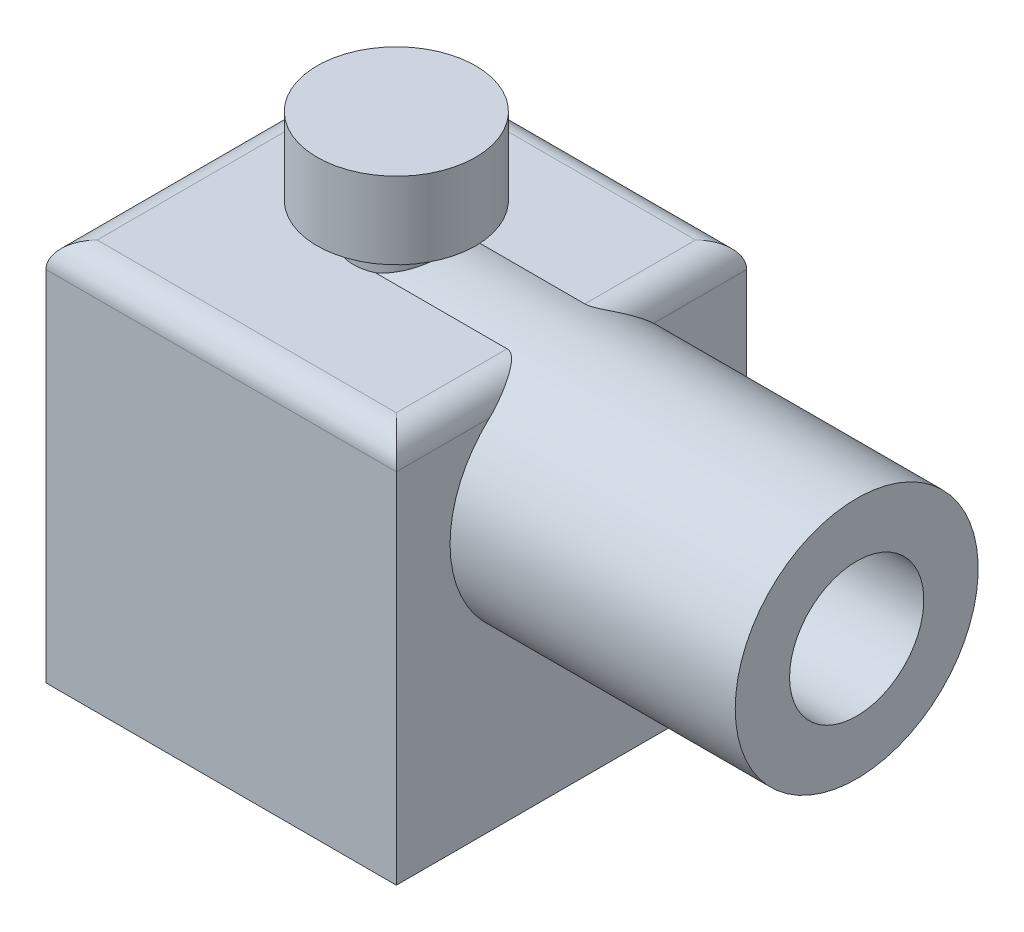
ISO-10303-21;
HEADER;
FILE_DESCRIPTION(('STEP AP214'),'2;1');
FILE_NAME('part.step','',(''),(''),'','','');
FILE_SCHEMA(('AUTOMOTIVE_DESIGN { 1 0 10303 214 1 1 1 1 }'));
ENDSEC;
DATA;
#1=APPLICATION_CONTEXT('core data for automotive mechanical design processes');
#2=APPLICATION_PROTOCOL_DEFINITION('international standard','automotive_design',2000,#1);
#3=PRODUCT_CONTEXT('',#1,'mechanical');
#4=PRODUCT('Part','Part','',(#3));
#5=PRODUCT_RELATED_PRODUCT_CATEGORY('part','',(#4));
#6=PRODUCT_DEFINITION_FORMATION('','',#4);
#7=PRODUCT_DEFINITION_CONTEXT('part definition',#1,'design');
#8=PRODUCT_DEFINITION('design','',#6,#7);
#9=PRODUCT_DEFINITION_SHAPE('','',#8);
#10=(LENGTH_UNIT() NAMED_UNIT(*) SI_UNIT(.MILLI.,.METRE.));
#11=(NAMED_UNIT(*) PLANE_ANGLE_UNIT() SI_UNIT($,.RADIAN.));
#12=(NAMED_UNIT(*) SI_UNIT($,.STERADIAN.) SOLID_ANGLE_UNIT());
#13=UNCERTAINTY_MEASURE_WITH_UNIT(LENGTH_MEASURE(1.E-05),#10,'distance_accuracy_value','');
#14=(GEOMETRIC_REPRESENTATION_CONTEXT(3) GLOBAL_UNCERTAINTY_ASSIGNED_CONTEXT((#13)) GLOBAL_UNIT_ASSIGNED_CONTEXT((#10,
#11,#12)) REPRESENTATION_CONTEXT('',''));
#15=CARTESIAN_POINT('',(0.,0.,0.));
#16=DIRECTION('',(0.,0.,1.));
#17=DIRECTION('',(1.,0.,0.));
#18=AXIS2_PLACEMENT_3D('',#15,#16,#17);
#19=CARTESIAN_POINT('',(0.,38.7,0.));
#20=DIRECTION('',(0.,-1.,0.));
#21=DIRECTION('',(0.,0.,-1.));
#22=AXIS2_PLACEMENT_3D('',#19,#20,#21);
#23=PLANE('',#22);
#24=CARTESIAN_POINT('',(0.,38.7,0.));
#25=DIRECTION('',(0.,-1.,0.));
#26=DIRECTION('',(1.,0.,0.));
#27=AXIS2_PLACEMENT_3D('',#24,#25,#26);
#28=CIRCLE('',#27,6.2);
#29=CARTESIAN_POINT('',(6.2,38.7,0.));
#30=VERTEX_POINT('',#29);
#31=EDGE_CURVE('E11',#30,#30,#28,.T.);
#32=ORIENTED_EDGE('',*,*,#31,.F.);
#33=EDGE_LOOP('',(#32));
#34=FACE_BOUND('',#33,.T.);
#35=ADVANCED_FACE('F17',(#34),#23,.F.);
#36=CARTESIAN_POINT('',(0.,39.135,0.));
#37=DIRECTION('',(0.,-1.,0.));
#38=DIRECTION('',(-1.,0.,0.));
#39=AXIS2_PLACEMENT_3D('',#36,#37,#38);
#40=CYLINDRICAL_SURFACE('',#39,6.2);
#41=CARTESIAN_POINT('',(0.,32.7,0.));
#42=DIRECTION('',(0.,-1.,0.));
#43=DIRECTION('',(1.,0.,0.));
#44=AXIS2_PLACEMENT_3D('',#41,#42,#43);
#45=CIRCLE('',#44,6.2);
#46=CARTESIAN_POINT('',(6.2,32.7,0.));
#47=VERTEX_POINT('',#46);
#48=EDGE_CURVE('E206',#47,#47,#45,.T.);
#49=ORIENTED_EDGE('',*,*,#48,.F.);
#50=DIRECTION('',(0.,1.,0.));
#51=VECTOR('',#50,1.);
#52=CARTESIAN_POINT('',(6.2,39.135,0.));
#53=LINE('',#52,#51);
#54=EDGE_CURVE('E28',#47,#30,#53,.T.);
#55=ORIENTED_EDGE('',*,*,#54,.T.);
#56=ORIENTED_EDGE('',*,*,#31,.T.);
#57=ORIENTED_EDGE('',*,*,#54,.F.);
#58=EDGE_LOOP('',(#49,#55,#56,#57));
#59=FACE_BOUND('',#58,.T.);
#60=ADVANCED_FACE('F313',(#59),#40,.T.);
#61=CARTESIAN_POINT('',(0.,32.7,0.));
#62=DIRECTION('',(0.,-1.,0.));
#63=DIRECTION('',(0.,0.,-1.));
#64=AXIS2_PLACEMENT_3D('',#61,#62,#63);
#65=PLANE('',#64);
#66=CARTESIAN_POINT('',(0.,32.7,0.));
#67=DIRECTION('',(0.,-1.,0.));
#68=DIRECTION('',(1.,0.,0.));
#69=AXIS2_PLACEMENT_3D('',#66,#67,#68);
#70=CIRCLE('',#69,3.35);
#71=CARTESIAN_POINT('',(3.35,32.7,0.));
#72=VERTEX_POINT('',#71);
#73=EDGE_CURVE('E175',#72,#72,#70,.T.);
#74=ORIENTED_EDGE('',*,*,#73,.F.);
#75=EDGE_LOOP('',(#74));
#76=FACE_BOUND('',#75,.T.);
#77=ORIENTED_EDGE('',*,*,#48,.T.);
#78=EDGE_LOOP('',(#77));
#79=FACE_BOUND('',#78,.T.);
#80=ADVANCED_FACE('F316',(#76,#79),#65,.T.);
#81=CARTESIAN_POINT('',(-11.7,28.,49.41864));
#82=DIRECTION('',(0.,0.,-1.));
#83=DIRECTION('',(-1.,0.,0.));
#84=AXIS2_PLACEMENT_3D('',#81,#82,#83);
#85=CYLINDRICAL_SURFACE('',#84,2.);
#86=DIRECTION('',(0.,0.,-1.));
#87=VECTOR('',#86,1.);
#88=CARTESIAN_POINT('',(-13.7,28.,13.7));
#89=LINE('',#88,#87);
#90=CARTESIAN_POINT('',(-13.7,28.,13.7));
#91=VERTEX_POINT('',#90);
#92=CARTESIAN_POINT('',(-13.7,28.,-13.7));
#93=VERTEX_POINT('',#92);
#94=EDGE_CURVE('E126',#91,#93,#89,.T.);
#95=ORIENTED_EDGE('',*,*,#94,.F.);
#96=CARTESIAN_POINT('',(-11.7,28.,11.7));
#97=DIRECTION('',(0.707106781186548,0.,0.707106781186547));
#98=DIRECTION('',(-0.707106781186547,0.,0.707106781186548));
#99=AXIS2_PLACEMENT_3D('',#96,#97,#98);
#100=ELLIPSE('',#99,2.82842712474619,2.);
#101=CARTESIAN_POINT('',(-11.7,30.,11.7));
#102=VERTEX_POINT('',#101);
#103=EDGE_CURVE('E189',#102,#91,#100,.T.);
#104=ORIENTED_EDGE('',*,*,#103,.F.);
#105=DIRECTION('',(0.,0.,-1.));
#106=VECTOR('',#105,1.);
#107=CARTESIAN_POINT('',(-11.7,30.,11.7));
#108=LINE('',#107,#106);
#109=CARTESIAN_POINT('',(-11.7,30.,-11.7));
#110=VERTEX_POINT('',#109);
#111=EDGE_CURVE('E179',#102,#110,#108,.T.);
#112=ORIENTED_EDGE('',*,*,#111,.T.);
#113=CARTESIAN_POINT('',(-11.7,28.,-11.7));
#114=DIRECTION('',(-0.707106781186548,0.,0.707106781186547));
#115=DIRECTION('',(-0.707106781186547,0.,-0.707106781186548));
#116=AXIS2_PLACEMENT_3D('',#113,#114,#115);
#117=ELLIPSE('',#116,2.82842712474619,2.);
#118=EDGE_CURVE('E374',#110,#93,#117,.T.);
#119=ORIENTED_EDGE('',*,*,#118,.T.);
#120=EDGE_LOOP('',(#95,#104,#112,#119));
#121=FACE_BOUND('',#120,.T.);
#122=ADVANCED_FACE('F319',(#121),#85,.T.);
#123=CARTESIAN_POINT('',(-13.7,30.,-13.7));
#124=DIRECTION('',(-1.,0.,0.));
#125=DIRECTION('',(0.,0.,1.));
#126=AXIS2_PLACEMENT_3D('',#123,#124,#125);
#127=PLANE('',#126);
#128=ORIENTED_EDGE('',*,*,#94,.T.);
#129=DIRECTION('',(0.,-1.,0.));
#130=VECTOR('',#129,1.);
#131=CARTESIAN_POINT('',(-13.7,28.,-13.7));
#132=LINE('',#131,#130);
#133=CARTESIAN_POINT('',(-13.7,0.,-13.7));
#134=VERTEX_POINT('',#133);
#135=EDGE_CURVE('E173',#93,#134,#132,.T.);
#136=ORIENTED_EDGE('',*,*,#135,.T.);
#137=DIRECTION('',(0.,0.,1.));
#138=VECTOR('',#137,1.);
#139=CARTESIAN_POINT('',(-13.7,0.,-13.7));
#140=LINE('',#139,#138);
#141=CARTESIAN_POINT('',(-13.7,0.,13.7));
#142=VERTEX_POINT('',#141);
#143=EDGE_CURVE('E203',#134,#142,#140,.T.);
#144=ORIENTED_EDGE('',*,*,#143,.T.);
#145=DIRECTION('',(0.,-1.,0.));
#146=VECTOR('',#145,1.);
#147=CARTESIAN_POINT('',(-13.7,28.,13.7));
#148=LINE('',#147,#146);
#149=EDGE_CURVE('E188',#91,#142,#148,.T.);
#150=ORIENTED_EDGE('',*,*,#149,.F.);
#151=EDGE_LOOP('',(#128,#136,#144,#150));
#152=FACE_BOUND('',#151,.T.);
#153=ADVANCED_FACE('F269',(#152),#127,.T.);
#154=CARTESIAN_POINT('',(-13.7,0.,-13.7));
#155=DIRECTION('',(0.,-1.,0.));
#156=DIRECTION('',(0.,0.,-1.));
#157=AXIS2_PLACEMENT_3D('',#154,#155,#156);
#158=PLANE('',#157);
#159=DIRECTION('',(1.,0.,0.));
#160=VECTOR('',#159,1.);
#161=CARTESIAN_POINT('',(-13.7,0.,-13.7));
#162=LINE('',#161,#160);
#163=CARTESIAN_POINT('',(13.7,0.,-13.7));
#164=VERTEX_POINT('',#163);
#165=EDGE_CURVE('E198',#134,#164,#162,.T.);
#166=ORIENTED_EDGE('',*,*,#165,.T.);
#167=DIRECTION('',(0.,0.,1.));
#168=VECTOR('',#167,1.);
#169=CARTESIAN_POINT('',(13.7,0.,-13.7));
#170=LINE('',#169,#168);
#171=CARTESIAN_POINT('',(13.7,0.,13.7));
#172=VERTEX_POINT('',#171);
#173=EDGE_CURVE('E190',#164,#172,#170,.T.);
#174=ORIENTED_EDGE('',*,*,#173,.T.);
#175=DIRECTION('',(1.,0.,0.));
#176=VECTOR('',#175,1.);
#177=CARTESIAN_POINT('',(-13.7,0.,13.7));
#178=LINE('',#177,#176);
#179=EDGE_CURVE('E377',#142,#172,#178,.T.);
#180=ORIENTED_EDGE('',*,*,#179,.F.);
#181=ORIENTED_EDGE('',*,*,#143,.F.);
#182=EDGE_LOOP('',(#166,#174,#180,#181));
#183=FACE_BOUND('',#182,.T.);
#184=ADVANCED_FACE('F429',(#183),#158,.T.);
#185=CARTESIAN_POINT('',(36.,0.,0.));
#186=DIRECTION('',(1.,0.,0.));
#187=DIRECTION('',(0.,1.,0.));
#188=AXIS2_PLACEMENT_3D('',#185,#186,#187);
#189=PLANE('',#188);
#190=CARTESIAN_POINT('',(36.,21.,0.));
#191=DIRECTION('',(-1.,0.,0.));
#192=DIRECTION('',(0.,0.,-1.));
#193=AXIS2_PLACEMENT_3D('',#190,#191,#192);
#194=CIRCLE('',#193,5.25);
#195=CARTESIAN_POINT('',(36.,21.,5.25));
#196=VERTEX_POINT('',#195);
#197=EDGE_CURVE('E200',#196,#196,#194,.T.);
#198=ORIENTED_EDGE('',*,*,#197,.T.);
#199=EDGE_LOOP('',(#198));
#200=FACE_BOUND('',#199,.T.);
#201=CARTESIAN_POINT('',(36.,21.,0.));
#202=DIRECTION('',(1.,0.,0.));
#203=DIRECTION('',(0.,0.,-1.));
#204=AXIS2_PLACEMENT_3D('',#201,#202,#203);
#205=CIRCLE('',#204,9.5);
#206=CARTESIAN_POINT('',(36.,21.,9.5));
#207=VERTEX_POINT('',#206);
#208=EDGE_CURVE('E162',#207,#207,#205,.T.);
#209=ORIENTED_EDGE('',*,*,#208,.T.);
#210=EDGE_LOOP('',(#209));
#211=FACE_BOUND('',#210,.T.);
#212=ADVANCED_FACE('F267',(#200,#211),#189,.T.);
#213=CARTESIAN_POINT('',(36.,21.,0.));
#214=DIRECTION('',(1.,0.,0.));
#215=DIRECTION('',(0.,0.,-1.));
#216=AXIS2_PLACEMENT_3D('',#213,#214,#215);
#217=CYLINDRICAL_SURFACE('',#216,5.25);
#218=CARTESIAN_POINT('',(13.7,21.,0.));
#219=DIRECTION('',(1.,0.,0.));
#220=DIRECTION('',(0.,0.,1.));
#221=AXIS2_PLACEMENT_3D('',#218,#219,#220);
#222=CIRCLE('',#221,5.25);
#223=CARTESIAN_POINT('',(13.7,21.,5.25));
#224=VERTEX_POINT('',#223);
#225=EDGE_CURVE('E194',#224,#224,#222,.T.);
#226=ORIENTED_EDGE('',*,*,#225,.F.);
#227=DIRECTION('',(1.,0.,0.));
#228=VECTOR('',#227,1.);
#229=CARTESIAN_POINT('',(36.,21.,5.25));
#230=LINE('',#229,#228);
#231=EDGE_CURVE('E193',#224,#196,#230,.T.);
#232=ORIENTED_EDGE('',*,*,#231,.T.);
#233=ORIENTED_EDGE('',*,*,#197,.F.);
#234=ORIENTED_EDGE('',*,*,#231,.F.);
#235=EDGE_LOOP('',(#226,#232,#233,#234));
#236=FACE_BOUND('',#235,.T.);
#237=ADVANCED_FACE('F304',(#236),#217,.F.);
#238=CARTESIAN_POINT('',(13.7,0.,-13.7));
#239=DIRECTION('',(1.,0.,0.));
#240=DIRECTION('',(0.,1.,0.));
#241=AXIS2_PLACEMENT_3D('',#238,#239,#240);
#242=PLANE('',#241);
#243=CARTESIAN_POINT('',(13.7,21.,0.));
#244=DIRECTION('',(1.,0.,0.));
#245=DIRECTION('',(0.,0.,-1.));
#246=AXIS2_PLACEMENT_3D('',#243,#244,#245);
#247=CIRCLE('',#246,9.5);
#248=CARTESIAN_POINT('',(13.7,28.,6.422616289333));
#249=VERTEX_POINT('',#248);
#250=CARTESIAN_POINT('',(13.7,21.,9.5));
#251=VERTEX_POINT('',#250);
#252=EDGE_CURVE('E137',#249,#251,#247,.T.);
#253=ORIENTED_EDGE('',*,*,#252,.F.);
#254=DIRECTION('',(0.,0.,-1.));
#255=VECTOR('',#254,1.);
#256=CARTESIAN_POINT('',(13.7,28.,13.7));
#257=LINE('',#256,#255);
#258=CARTESIAN_POINT('',(13.7,28.,13.7));
#259=VERTEX_POINT('',#258);
#260=EDGE_CURVE('E169',#259,#249,#257,.T.);
#261=ORIENTED_EDGE('',*,*,#260,.F.);
#262=DIRECTION('',(0.,1.,0.));
#263=VECTOR('',#262,1.);
#264=CARTESIAN_POINT('',(13.7,0.,13.7));
#265=LINE('',#264,#263);
#266=EDGE_CURVE('E375',#172,#259,#265,.T.);
#267=ORIENTED_EDGE('',*,*,#266,.F.);
#268=ORIENTED_EDGE('',*,*,#173,.F.);
#269=DIRECTION('',(0.,1.,0.));
#270=VECTOR('',#269,1.);
#271=CARTESIAN_POINT('',(13.7,0.,-13.7));
#272=LINE('',#271,#270);
#273=CARTESIAN_POINT('',(13.7,28.,-13.7));
#274=VERTEX_POINT('',#273);
#275=EDGE_CURVE('E195',#164,#274,#272,.T.);
#276=ORIENTED_EDGE('',*,*,#275,.T.);
#277=DIRECTION('',(0.,0.,-1.));
#278=VECTOR('',#277,1.);
#279=CARTESIAN_POINT('',(13.7,28.,-6.422616289333));
#280=LINE('',#279,#278);
#281=CARTESIAN_POINT('',(13.7,28.,-6.422616289333));
#282=VERTEX_POINT('',#281);
#283=EDGE_CURVE('E114',#282,#274,#280,.T.);
#284=ORIENTED_EDGE('',*,*,#283,.F.);
#285=CARTESIAN_POINT('',(13.7,21.,0.));
#286=DIRECTION('',(1.,0.,0.));
#287=DIRECTION('',(0.,0.,-1.));
#288=AXIS2_PLACEMENT_3D('',#285,#286,#287);
#289=CIRCLE('',#288,9.5);
#290=EDGE_CURVE('E155',#251,#282,#289,.T.);
#291=ORIENTED_EDGE('',*,*,#290,.F.);
#292=EDGE_LOOP('',(#253,#261,#267,#268,#276,#284,#291));
#293=FACE_BOUND('',#292,.T.);
#294=ADVANCED_FACE('F156',(#293),#242,.T.);
#295=CARTESIAN_POINT('',(13.7,0.,-13.7));
#296=DIRECTION('',(1.,0.,0.));
#297=DIRECTION('',(0.,1.,0.));
#298=AXIS2_PLACEMENT_3D('',#295,#296,#297);
#299=PLANE('',#298);
#300=ORIENTED_EDGE('',*,*,#225,.T.);
#301=EDGE_LOOP('',(#300));
#302=FACE_BOUND('',#301,.T.);
#303=ADVANCED_FACE('F234',(#302),#299,.T.);
#304=CARTESIAN_POINT('',(0.,0.,13.7));
#305=DIRECTION('',(0.,0.,1.));
#306=DIRECTION('',(1.,0.,0.));
#307=AXIS2_PLACEMENT_3D('',#304,#305,#306);
#308=PLANE('',#307);
#309=DIRECTION('',(-1.,0.,0.));
#310=VECTOR('',#309,1.);
#311=CARTESIAN_POINT('',(13.7,28.,13.7));
#312=LINE('',#311,#310);
#313=EDGE_CURVE('E184',#259,#91,#312,.T.);
#314=ORIENTED_EDGE('',*,*,#313,.T.);
#315=ORIENTED_EDGE('',*,*,#149,.T.);
#316=ORIENTED_EDGE('',*,*,#179,.T.);
#317=ORIENTED_EDGE('',*,*,#266,.T.);
#318=EDGE_LOOP('',(#314,#315,#316,#317));
#319=FACE_BOUND('',#318,.T.);
#320=ADVANCED_FACE('F431',(#319),#308,.T.);
#321=CARTESIAN_POINT('',(49.41864,28.,11.7));
#322=DIRECTION('',(-1.,0.,0.));
#323=DIRECTION('',(0.,0.,1.));
#324=AXIS2_PLACEMENT_3D('',#321,#322,#323);
#325=CYLINDRICAL_SURFACE('',#324,2.);
#326=DIRECTION('',(-1.,0.,0.));
#327=VECTOR('',#326,1.);
#328=CARTESIAN_POINT('',(11.7,30.,11.7));
#329=LINE('',#328,#327);
#330=CARTESIAN_POINT('',(11.7,30.,11.7));
#331=VERTEX_POINT('',#330);
#332=EDGE_CURVE('E182',#331,#102,#329,.T.);
#333=ORIENTED_EDGE('',*,*,#332,.T.);
#334=ORIENTED_EDGE('',*,*,#103,.T.);
#335=ORIENTED_EDGE('',*,*,#313,.F.);
#336=CARTESIAN_POINT('',(11.7,28.,11.7));
#337=DIRECTION('',(0.707106781186547,0.,-0.707106781186548));
#338=DIRECTION('',(0.707106781186548,0.,0.707106781186547));
#339=AXIS2_PLACEMENT_3D('',#336,#337,#338);
#340=ELLIPSE('',#339,2.82842712474619,2.);
#341=EDGE_CURVE('E354',#331,#259,#340,.T.);
#342=ORIENTED_EDGE('',*,*,#341,.F.);
#343=EDGE_LOOP('',(#333,#334,#335,#342));
#344=FACE_BOUND('',#343,.T.);
#345=ADVANCED_FACE('F19',(#344),#325,.T.);
#346=CARTESIAN_POINT('',(13.7,30.,-13.7));
#347=DIRECTION('',(0.,1.,0.));
#348=DIRECTION('',(1.,0.,0.));
#349=AXIS2_PLACEMENT_3D('',#346,#347,#348);
#350=PLANE('',#349);
#351=CARTESIAN_POINT('',(0.,30.,0.));
#352=DIRECTION('',(0.,-1.,0.));
#353=DIRECTION('',(0.419240952393704,0.,0.907875004522109));
#354=AXIS2_PLACEMENT_3D('',#351,#352,#353);
#355=CIRCLE('',#354,3.35);
#356=CARTESIAN_POINT('',(1.404457190519,30.,3.041381265149));
#357=VERTEX_POINT('',#356);
#358=CARTESIAN_POINT('',(1.404457190519,30.,-3.041381265149));
#359=VERTEX_POINT('',#358);
#360=EDGE_CURVE('E151',#357,#359,#355,.T.);
#361=ORIENTED_EDGE('',*,*,#360,.T.);
#362=DIRECTION('',(1.,0.,0.));
#363=VECTOR('',#362,1.);
#364=CARTESIAN_POINT('',(1.404457190519,30.,-3.041381265149));
#365=LINE('',#364,#363);
#366=CARTESIAN_POINT('',(11.7,30.,-3.041381265149));
#367=VERTEX_POINT('',#366);
#368=EDGE_CURVE('E160',#359,#367,#365,.T.);
#369=ORIENTED_EDGE('',*,*,#368,.T.);
#370=DIRECTION('',(0.,0.,-1.));
#371=VECTOR('',#370,1.);
#372=CARTESIAN_POINT('',(11.7,30.,-3.041381265149));
#373=LINE('',#372,#371);
#374=CARTESIAN_POINT('',(11.7,30.,-11.7));
#375=VERTEX_POINT('',#374);
#376=EDGE_CURVE('E339',#367,#375,#373,.T.);
#377=ORIENTED_EDGE('',*,*,#376,.T.);
#378=DIRECTION('',(1.,0.,0.));
#379=VECTOR('',#378,1.);
#380=CARTESIAN_POINT('',(-11.7,30.,-11.7));
#381=LINE('',#380,#379);
#382=EDGE_CURVE('E369',#110,#375,#381,.T.);
#383=ORIENTED_EDGE('',*,*,#382,.F.);
#384=ORIENTED_EDGE('',*,*,#111,.F.);
#385=ORIENTED_EDGE('',*,*,#332,.F.);
#386=DIRECTION('',(0.,0.,-1.));
#387=VECTOR('',#386,1.);
#388=CARTESIAN_POINT('',(11.7,30.,11.7));
#389=LINE('',#388,#387);
#390=CARTESIAN_POINT('',(11.7,30.,3.041381265149));
#391=VERTEX_POINT('',#390);
#392=EDGE_CURVE('E293',#331,#391,#389,.T.);
#393=ORIENTED_EDGE('',*,*,#392,.T.);
#394=DIRECTION('',(1.,0.,0.));
#395=VECTOR('',#394,1.);
#396=CARTESIAN_POINT('',(1.404457190519,30.,3.041381265149));
#397=LINE('',#396,#395);
#398=EDGE_CURVE('E152',#357,#391,#397,.T.);
#399=ORIENTED_EDGE('',*,*,#398,.F.);
#400=EDGE_LOOP('',(#361,#369,#377,#383,#384,#385,#393,#399));
#401=FACE_BOUND('',#400,.T.);
#402=ADVANCED_FACE('F233',(#401),#350,.T.);
#403=CARTESIAN_POINT('',(0.,39.135,0.));
#404=DIRECTION('',(0.,-1.,0.));
#405=DIRECTION('',(-1.,0.,0.));
#406=AXIS2_PLACEMENT_3D('',#403,#404,#405);
#407=CYLINDRICAL_SURFACE('',#406,3.35);
#408=ORIENTED_EDGE('',*,*,#360,.F.);
#409=CARTESIAN_POINT('',(1.404457190519,30.,3.04138126514902));
#410=CARTESIAN_POINT('',(1.44313302482649,30.0060442643099,3.02352157634422));
#411=CARTESIAN_POINT('',(1.48143933172237,30.0123057875487,3.00493720354744));
#412=CARTESIAN_POINT('',(1.56107049923112,30.0258254467507,2.96441385547286));
#413=CARTESIAN_POINT('',(1.60231306468751,30.0331205686363,2.94232534938207));
#414=CARTESIAN_POINT('',(1.68750871775984,30.0487048198177,2.89437669822332));
#415=CARTESIAN_POINT('',(1.73136616254205,30.0570239391425,2.86835628937065));
#416=CARTESIAN_POINT('',(1.82142016963686,30.0746637317243,2.81211265567683));
#417=CARTESIAN_POINT('',(1.86750584148753,30.0840099989195,2.78171992873564));
#418=CARTESIAN_POINT('',(1.96157966711492,30.1037098970144,2.71629082189942));
#419=CARTESIAN_POINT('',(2.00944021105804,30.1140856093221,2.68107708611437));
#420=CARTESIAN_POINT('',(2.08100621352498,30.130117412407,2.62543178709402));
#421=CARTESIAN_POINT('',(2.10542756104993,30.1356841323705,2.60588805941187));
#422=CARTESIAN_POINT('',(2.15452492508274,30.1470828231767,2.56545663473709));
#423=CARTESIAN_POINT('',(2.17918135254791,30.1529173760742,2.54454583516168));
#424=CARTESIAN_POINT('',(2.23213182429606,30.1656305271502,2.49830534019359));
#425=CARTESIAN_POINT('',(2.26030837992368,30.1725133562521,2.47284213236715));
#426=CARTESIAN_POINT('',(2.31418189026497,30.1858492894502,2.42246619162599));
#427=CARTESIAN_POINT('',(2.33992808016231,30.1923042596518,2.39760656300007));
#428=CARTESIAN_POINT('',(2.38906012782484,30.2048011070776,2.34862092167487));
#429=CARTESIAN_POINT('',(2.41249394581646,30.2108440597117,2.32454330055582));
#430=CARTESIAN_POINT('',(2.45712307855881,30.2225121693487,2.27728620828581));
#431=CARTESIAN_POINT('',(2.4783646618579,30.2281388489367,2.25415070733718));
#432=CARTESIAN_POINT('',(2.53672327388903,30.2438067620403,2.18876598271184));
#433=CARTESIAN_POINT('',(2.57311882105254,30.2538223105889,2.14586190946099));
#434=CARTESIAN_POINT('',(2.63820734800497,30.2721735457055,2.06509479859978));
#435=CARTESIAN_POINT('',(2.66721620729274,30.280527552758,2.02748947061637));
#436=CARTESIAN_POINT('',(2.71840996960852,30.29556340322,1.95812312539101));
#437=CARTESIAN_POINT('',(2.74086509253115,30.3022689047034,1.92656668050016));
#438=CARTESIAN_POINT('',(2.77971848530504,30.3139645179401,1.86990984261963));
#439=CARTESIAN_POINT('',(2.79633557737002,30.3189988186896,1.84496808256135));
#440=CARTESIAN_POINT('',(2.84473887261309,30.3336658255465,1.77015658321491));
#441=CARTESIAN_POINT('',(2.87557684713759,30.3430139617381,1.71961185744142));
#442=CARTESIAN_POINT('',(2.93400312082362,30.3609240037754,1.61786950487481));
#443=CARTESIAN_POINT('',(2.96164259746589,30.3694975905367,1.56670323773141));
#444=CARTESIAN_POINT('',(3.01374731987846,30.3858062589579,1.46392650730169));
#445=CARTESIAN_POINT('',(3.03826401291403,30.3935544457105,1.41234423133019));
#446=CARTESIAN_POINT('',(3.08420160715816,30.4082253601698,1.30894516884524));
#447=CARTESIAN_POINT('',(3.1056741581737,30.4151613857389,1.25715321009829));
#448=CARTESIAN_POINT('',(3.14561512208117,30.42820400502,1.15352793862636));
#449=CARTESIAN_POINT('',(3.16413510894083,30.4343244335999,1.10171624888785));
#450=CARTESIAN_POINT('',(3.19827140729771,30.4457362928804,0.998232457238896));
#451=CARTESIAN_POINT('',(3.21393900915263,30.4510420240408,0.946578852382088));
#452=CARTESIAN_POINT('',(3.24247927397372,30.4608237591032,0.843578733895279));
#453=CARTESIAN_POINT('',(3.25540273242948,30.4653145664416,0.792247702703012));
#454=CARTESIAN_POINT('',(3.27857026877931,30.473466000846,0.690047149870981));
#455=CARTESIAN_POINT('',(3.28886445170324,30.4771419422808,0.639190209445663));
#456=CARTESIAN_POINT('',(3.30689463394972,30.4836631287576,0.538079205964679));
#457=CARTESIAN_POINT('',(3.3146798637381,30.4865242127137,0.487834945290695));
#458=CARTESIAN_POINT('',(3.32781799417243,30.4914150730173,0.388077932425546));
#459=CARTESIAN_POINT('',(3.33321907499692,30.4934612256322,0.33857232991744));
#460=CARTESIAN_POINT('',(3.3417178036732,30.4967219671331,0.240408527805103));
#461=CARTESIAN_POINT('',(3.34486242871161,30.4979534708646,0.191754962118386));
#462=CARTESIAN_POINT('',(3.34898125037852,30.499583310001,0.0953997575580311));
#463=CARTESIAN_POINT('',(3.35000103527652,30.499999134041,0.0477003556813545));
#464=CARTESIAN_POINT('',(3.35,30.5,0.));
#465=B_SPLINE_CURVE_WITH_KNOTS('',3,(#409,#410,#411,#412,#413,#414,#415,#416,#417,#418,#419,
#420,#421,#422,#423,#424,#425,#426,#427,#428,#429,#430,#431,#432,#433,#434,#435,#436,#437,#438,
#439,#440,#441,#442,#443,#444,#445,#446,#447,#448,#449,#450,#451,#452,#453,#454,#455,#456,#457,
#458,#459,#460,#461,#462,#463,#464),.UNSPECIFIED.,.F.,.F.,(4,2,2,2,2,2,2,2,2,2,2,2,2,2,2,2,2,2,
2,2,2,2,2,2,2,2,2,4),(0.,0.129071875369828,0.271081112518538,0.42603597993999,0.593942677266448,
0.774805914596905,0.870106501888238,0.968648441578384,1.08441483879826,1.19349704272756,
1.29589498477846,1.39160860944263,1.5629695975656,1.70759831958757,1.82549355145165,
1.91665528400892,2.09638918669355,2.27265897254724,2.44548647789371,2.6148948729573,
2.7809087623601,2.9435542940711,3.1028592774992,3.25885331145639,3.4115679227456,
3.56103671614702,3.70729553658195,3.85038264422029),.UNSPECIFIED.);
#466=CARTESIAN_POINT('',(3.35,30.5,0.));
#467=VERTEX_POINT('',#466);
#468=EDGE_CURVE('E217',#357,#467,#465,.T.);
#469=ORIENTED_EDGE('',*,*,#468,.T.);
#470=DIRECTION('',(0.,1.,0.));
#471=VECTOR('',#470,1.);
#472=CARTESIAN_POINT('',(3.35,39.135,0.));
#473=LINE('',#472,#471);
#474=EDGE_CURVE('E180',#467,#72,#473,.T.);
#475=ORIENTED_EDGE('',*,*,#474,.T.);
#476=ORIENTED_EDGE('',*,*,#73,.T.);
#477=ORIENTED_EDGE('',*,*,#474,.F.);
#478=CARTESIAN_POINT('',(3.35,30.5,0.));
#479=CARTESIAN_POINT('',(3.35000103501008,30.4999991325421,-0.0476963839830357));
#480=CARTESIAN_POINT('',(3.34898142002569,30.4995833028249,-0.0953918135329404));
#481=CARTESIAN_POINT('',(3.34486324961289,30.4979534644943,-0.191739817192207));
#482=CARTESIAN_POINT('',(3.34171907815181,30.4967219542589,-0.240390153048963));
#483=CARTESIAN_POINT('',(3.33322148265371,30.4934612125082,-0.338548253962389));
#484=CARTESIAN_POINT('',(3.32782105241903,30.4914150543119,-0.388051382462744));
#485=CARTESIAN_POINT('',(3.31468435879904,30.4865241940668,-0.487804213621036));
#486=CARTESIAN_POINT('',(3.30689988507775,30.4836631049208,-0.538046762486616));
#487=CARTESIAN_POINT('',(3.28887125631897,30.4771419184271,-0.639155108190687));
#488=CARTESIAN_POINT('',(3.27857783959945,30.473465972288,-0.690011096941407));
#489=CARTESIAN_POINT('',(3.25541177940587,30.4653145379364,-0.792210502821788));
#490=CARTESIAN_POINT('',(3.2424889987309,30.4608237263569,-0.843541331309217));
#491=CARTESIAN_POINT('',(3.21394993316732,30.4510419912515,-0.946541781468841));
#492=CARTESIAN_POINT('',(3.1982828197785,30.4457362560988,-0.998195911420266));
#493=CARTESIAN_POINT('',(3.1641472403824,30.4343243972219,-1.10168146056839));
#494=CARTESIAN_POINT('',(3.14562745029404,30.4282039656144,-1.15349437144151));
#495=CARTESIAN_POINT('',(3.10568652016104,30.4151613451171,-1.25712275092461));
#496=CARTESIAN_POINT('',(3.08421377186588,30.4082253145552,-1.30891658314167));
#497=CARTESIAN_POINT('',(3.03827532095394,30.3935544052476,-1.41232000678408));
#498=CARTESIAN_POINT('',(3.01375793381579,30.3858062227321,-1.46390475481608));
#499=CARTESIAN_POINT('',(2.96165126577489,30.3694975349408,-1.5666869720405));
#500=CARTESIAN_POINT('',(2.93401050276725,30.3609239182441,-1.6178562357473));
#501=CARTESIAN_POINT('',(2.87558098786915,30.3430139516844,-1.71960506909789));
#502=CARTESIAN_POINT('',(2.8447410232486,30.3336659189086,-1.77015325898445));
#503=CARTESIAN_POINT('',(2.79633750608847,30.3189996862512,-1.84496510167925));
#504=CARTESIAN_POINT('',(2.77972242320316,30.3139662389966,-1.86990393154645));
#505=CARTESIAN_POINT('',(2.74087242340204,30.3022720062828,-1.92655620859352));
#506=CARTESIAN_POINT('',(2.71841867109188,30.2955669728491,-1.95811100305702));
#507=CARTESIAN_POINT('',(2.66722695236922,30.2805317731069,-2.02747531846652));
#508=CARTESIAN_POINT('',(2.6382187312914,30.272177930347,-2.06508023954895));
#509=CARTESIAN_POINT('',(2.57313066660379,30.2538267007483,-2.14584772418804));
#510=CARTESIAN_POINT('',(2.5367348918955,30.2438109758371,-2.18875253580568));
#511=CARTESIAN_POINT('',(2.47837555075501,30.228142660408,-2.25413874768518));
#512=CARTESIAN_POINT('',(2.45713347490638,30.222515771569,-2.27727500312162));
#513=CARTESIAN_POINT('',(2.41250308080777,30.2108471604606,-2.32453383790549));
#514=CARTESIAN_POINT('',(2.38906848486318,30.2048039143337,-2.34861243849735));
#515=CARTESIAN_POINT('',(2.33993457912262,30.1923063987365,-2.39760024425775));
#516=CARTESIAN_POINT('',(2.31418729924285,30.1858510529229,-2.42246104801968));
#517=CARTESIAN_POINT('',(2.26031128085309,30.1725142809139,-2.47283951081045));
#518=CARTESIAN_POINT('',(2.23213329677114,30.1656309873083,-2.4983040543037));
#519=CARTESIAN_POINT('',(2.17918304215149,30.152917690991,-2.54454435967565));
#520=CARTESIAN_POINT('',(2.15452834711065,30.1470834534679,-2.56545373260531));
#521=CARTESIAN_POINT('',(2.10543421224009,30.135685338439,-2.60588266351938));
#522=CARTESIAN_POINT('',(2.08101435290472,30.1301188791824,-2.62542531365552));
#523=CARTESIAN_POINT('',(2.00945193596211,30.1140876657551,-2.68106824414561));
#524=CARTESIAN_POINT('',(1.96159353218031,30.1037123013225,-2.71628075573796));
#525=CARTESIAN_POINT('',(1.86752276691532,30.0840128652292,-2.78170854950143));
#526=CARTESIAN_POINT('',(1.8214379647382,30.0746667165218,-2.81210111365872));
#527=CARTESIAN_POINT('',(1.73138432715789,30.0570269236743,-2.86834533940474));
#528=CARTESIAN_POINT('',(1.68752634150741,30.0487076921863,-2.89436643743781));
#529=CARTESIAN_POINT('',(1.6023281254317,30.0331229803889,-2.94231718644768));
#530=CARTESIAN_POINT('',(1.56108350562488,30.0258275194122,-2.96440704477747));
#531=CARTESIAN_POINT('',(1.48144667192356,30.0123069318905,-3.00493364260277));
#532=CARTESIAN_POINT('',(1.44313672777537,30.0060448347954,-3.02351986668187));
#533=CARTESIAN_POINT('',(1.404457190519,30.,-3.04138126514902));
#534=B_SPLINE_CURVE_WITH_KNOTS('',3,(#478,#479,#480,#481,#482,#483,#484,#485,#486,#487,#488,
#489,#490,#491,#492,#493,#494,#495,#496,#497,#498,#499,#500,#501,#502,#503,#504,#505,#506,#507,
#508,#509,#510,#511,#512,#513,#514,#515,#516,#517,#518,#519,#520,#521,#522,#523,#524,#525,#526,
#527,#528,#529,#530,#531,#532,#533),.UNSPECIFIED.,.F.,.F.,(4,2,2,2,2,2,2,2,2,2,2,2,2,2,2,2,2,2,
2,2,2,2,2,2,2,2,2,4),(0.,0.143075194254705,0.28932427018435,0.438785488563866,0.591494693159923,
0.747485486123539,0.906789390400916,1.06943599993319,1.23545311842828,1.40486688748227,
1.5777019048081,1.75398133330088,1.93372700163424,2.02487780259341,2.14276647388611,
2.28739300881744,2.45875618409829,2.5544725434579,2.65687431416622,2.76596144073504,
2.88173385458342,2.98026900441707,3.07556403590924,3.25641986650167,3.42432409442193,
3.57928143171343,3.72129807968204,3.85038230785889),.UNSPECIFIED.);
#535=EDGE_CURVE('E251',#467,#359,#534,.T.);
#536=ORIENTED_EDGE('',*,*,#535,.T.);
#537=EDGE_LOOP('',(#408,#469,#475,#476,#477,#536));
#538=FACE_BOUND('',#537,.T.);
#539=ADVANCED_FACE('F224',(#538),#407,.T.);
#540=CARTESIAN_POINT('',(36.,21.,0.));
#541=DIRECTION('',(1.,0.,0.));
#542=DIRECTION('',(0.,0.,-1.));
#543=AXIS2_PLACEMENT_3D('',#540,#541,#542);
#544=CYLINDRICAL_SURFACE('',#543,9.5);
#545=ORIENTED_EDGE('',*,*,#208,.F.);
#546=DIRECTION('',(-1.,0.,0.));
#547=VECTOR('',#546,1.);
#548=CARTESIAN_POINT('',(36.,21.,9.5));
#549=LINE('',#548,#547);
#550=EDGE_CURVE('E142',#207,#251,#549,.T.);
#551=ORIENTED_EDGE('',*,*,#550,.T.);
#552=ORIENTED_EDGE('',*,*,#290,.T.);
#553=CARTESIAN_POINT('',(13.7,28.,-6.42261628933256));
#554=CARTESIAN_POINT('',(13.7000002141254,28.0311544314174,-6.38866176934703));
#555=CARTESIAN_POINT('',(13.6992771860406,28.0620598955814,-6.35448138634665));
#556=CARTESIAN_POINT('',(13.6964228362274,28.1237590431218,-6.28523939254143));
#557=CARTESIAN_POINT('',(13.6942725082844,28.1545454988138,-6.25017211859649));
#558=CARTESIAN_POINT('',(13.6885641022124,28.2159805022175,-6.1791473687295));
#559=CARTESIAN_POINT('',(13.6849863257697,28.2466207768704,-6.14318433443044));
#560=CARTESIAN_POINT('',(13.676423729351,28.3077380845068,-6.07035891180273));
#561=CARTESIAN_POINT('',(13.6714186725136,28.3382058278512,-6.03349111612216));
#562=CARTESIAN_POINT('',(13.6600019679366,28.3989517266487,-5.95884759514462));
#563=CARTESIAN_POINT('',(13.6535696839586,28.4292195904669,-5.92106666132039));
#564=CARTESIAN_POINT('',(13.6392989506737,28.4895387630269,-5.8445888577556));
#565=CARTESIAN_POINT('',(13.6314395983338,28.5195788078425,-5.80588701749481));
#566=CARTESIAN_POINT('',(13.6143146879152,28.5794149820574,-5.72755943950508));
#567=CARTESIAN_POINT('',(13.6050280743093,28.6091989161594,-5.6879289918404));
#568=CARTESIAN_POINT('',(13.5850497592537,28.6684937341537,-5.60773867349203));
#569=CARTESIAN_POINT('',(13.5743369794098,28.6979915147741,-5.5671744086923));
#570=CARTESIAN_POINT('',(13.5412040910999,28.783160936058,-5.44809065534093));
#571=CARTESIAN_POINT('',(13.5171370303085,28.8377476602672,-5.36924444442708));
#572=CARTESIAN_POINT('',(13.4644687107768,28.9441177597689,-5.21058183552658));
#573=CARTESIAN_POINT('',(13.4358457940534,28.995886073839,-5.13076257588309));
#574=CARTESIAN_POINT('',(13.3740813379499,29.0966425404801,-4.97025337300143));
#575=CARTESIAN_POINT('',(13.3409095732216,29.1456086973906,-4.88956124597278));
#576=CARTESIAN_POINT('',(13.2700307898162,29.2407736121963,-4.72742766085546));
#577=CARTESIAN_POINT('',(13.2322855950501,29.286943454874,-4.64598600302349));
#578=CARTESIAN_POINT('',(13.1510965943811,29.377985933123,-4.47980947177022));
#579=CARTESIAN_POINT('',(13.1074781182096,29.4227186576595,-4.39508270710491));
#580=CARTESIAN_POINT('',(13.0393215543965,29.4862554413259,-4.27030855636798));
#581=CARTESIAN_POINT('',(13.0166556578531,29.5064470247145,-4.22993727876282));
#582=CARTESIAN_POINT('',(12.9707359503727,29.5454509542339,-4.1505625176565));
#583=CARTESIAN_POINT('',(12.9475144240298,29.5642858020718,-4.1115514840446));
#584=CARTESIAN_POINT('',(12.9004862625274,29.6006404284688,-4.03493909929606));
#585=CARTESIAN_POINT('',(12.8767122274703,29.6181819627185,-3.99732807804695));
#586=CARTESIAN_POINT('',(12.8285785831805,29.6520128630973,-3.92355393777409));
#587=CARTESIAN_POINT('',(12.8042518125472,29.6683231999686,-3.8873790500562));
#588=CARTESIAN_POINT('',(12.7550097330997,29.6997513623074,-3.8165152303152));
#589=CARTESIAN_POINT('',(12.7301273712066,29.7148893816557,-3.78181238626601));
#590=CARTESIAN_POINT('',(12.6797847917271,29.7440346351576,-3.7139179430088));
#591=CARTESIAN_POINT('',(12.6543570373324,29.7580611478287,-3.68071061080573));
#592=CARTESIAN_POINT('',(12.6089146858606,29.7818691406107,-3.62346143003956));
#593=CARTESIAN_POINT('',(12.589189332208,29.7918147901814,-3.59925834095292));
#594=CARTESIAN_POINT('',(12.5497527899906,29.8108651283863,-3.5523611139218));
#595=CARTESIAN_POINT('',(12.5300751394827,29.8199875893807,-3.52964608584529));
#596=CARTESIAN_POINT('',(12.4907409049273,29.8374295068982,-3.4857386181222));
#597=CARTESIAN_POINT('',(12.4711187265456,29.8457666094233,-3.46452243811645));
#598=CARTESIAN_POINT('',(12.4318920846889,29.8616707071158,-3.42363149527878));
#599=CARTESIAN_POINT('',(12.4123231109877,29.8692554006432,-3.40392967516152));
#600=CARTESIAN_POINT('',(12.3732024166967,29.8836858454086,-3.36608346560878));
#601=CARTESIAN_POINT('',(12.3536868555254,29.8905493828518,-3.34790859769496));
#602=CARTESIAN_POINT('',(12.3146720009002,29.9035661327391,-3.31313138919232));
#603=CARTESIAN_POINT('',(12.2952091454416,29.9097372712848,-3.29649503648221));
#604=CARTESIAN_POINT('',(12.2563000556232,29.9213952680769,-3.26480917270423));
#605=CARTESIAN_POINT('',(12.2368899296906,29.9269002154305,-3.24972211392575));
#606=CARTESIAN_POINT('',(12.1980847709103,29.9372500361109,-3.22114616196353));
#607=CARTESIAN_POINT('',(12.178724896533,29.9421131047189,-3.20761645855429));
#608=CARTESIAN_POINT('',(12.1493950992301,29.9489995448457,-3.1883305822964));
#609=CARTESIAN_POINT('',(12.139733065724,29.9511937036236,-3.18216470995698));
#610=CARTESIAN_POINT('',(12.1204180530548,29.9554269682382,-3.17023138389082));
#611=CARTESIAN_POINT('',(12.1107690528203,29.9574683477933,-3.16445831533854));
#612=CARTESIAN_POINT('',(12.0914805958697,29.9613983019955,-3.153311702738));
#613=CARTESIAN_POINT('',(12.0818449124909,29.9632891356673,-3.14793243134071));
#614=CARTESIAN_POINT('',(12.0625832172123,29.9669201712538,-3.13757424846977));
#615=CARTESIAN_POINT('',(12.0529607485748,29.9686626056222,-3.13258954046349));
#616=CARTESIAN_POINT('',(12.0337257464384,29.971998851919,-3.12302125906944));
#617=CARTESIAN_POINT('',(12.0241164925881,29.9735948574274,-3.11843186675726));
#618=CARTESIAN_POINT('',(12.0049081891766,29.9766401168398,-3.10965486800984));
#619=CARTESIAN_POINT('',(11.9953121269145,29.9780915103602,-3.10546147615112));
#620=CARTESIAN_POINT('',(11.9761305122394,29.9808492739647,-3.09747701382449));
#621=CARTESIAN_POINT('',(11.9665476292247,29.9821577124192,-3.09368025491734));
#622=CARTESIAN_POINT('',(11.9473927020669,29.984631154913,-3.08648946770918));
#623=CARTESIAN_POINT('',(11.9378229895554,29.9857981366001,-3.08308991879985));
#624=CARTESIAN_POINT('',(11.9186947521102,29.9879901167641,-3.07669382949415));
#625=CARTESIAN_POINT('',(11.9091382084451,29.9890169808264,-3.07369201334804));
#626=CARTESIAN_POINT('',(11.8900366687303,29.9909300408314,-3.06809153053912));
#627=CARTESIAN_POINT('',(11.8804933000386,29.9918179675448,-3.06548791454911));
#628=CARTESIAN_POINT('',(11.8614184718107,29.9934543323498,-3.060683834557));
#629=CARTESIAN_POINT('',(11.8518882927429,29.9942043428797,-3.05847883144757));
#630=CARTESIAN_POINT('',(11.8328401969916,29.9955659211782,-3.05447183471157));
#631=CARTESIAN_POINT('',(11.8233232326014,29.9961788795463,-3.0526657954909));
#632=CARTESIAN_POINT('',(11.8043018940193,29.99726725931,-3.04945646223364));
#633=CARTESIAN_POINT('',(11.794798175,29.9977438669822,-3.04804969535933));
#634=CARTESIAN_POINT('',(11.775803635084,29.9985603314789,-3.0456384486689));
#635=CARTESIAN_POINT('',(11.7663132152976,29.9989011495672,-3.0446311412972));
#636=CARTESIAN_POINT('',(11.7473454826805,29.9994466183464,-3.04301845643824));
#637=CARTESIAN_POINT('',(11.7378683715946,29.9996519881183,-3.04241095645213));
#638=CARTESIAN_POINT('',(11.7189276024918,29.9999272355146,-3.04159658571886));
#639=CARTESIAN_POINT('',(11.7094640098112,29.9999975754169,-3.04138834809068));
#640=CARTESIAN_POINT('',(11.7,30.,-3.04138126514909));
#641=B_SPLINE_CURVE_WITH_KNOTS('',3,(#553,#554,#555,#556,#557,#558,#559,#560,#561,#562,#563,
#564,#565,#566,#567,#568,#569,#570,#571,#572,#573,#574,#575,#576,#577,#578,#579,#580,#581,#582,
#583,#584,#585,#586,#587,#588,#589,#590,#591,#592,#593,#594,#595,#596,#597,#598,#599,#600,#601,
#602,#603,#604,#605,#606,#607,#608,#609,#610,#611,#612,#613,#614,#615,#616,#617,#618,#619,#620,
#621,#622,#623,#624,#625,#626,#627,#628,#629,#630,#631,#632,#633,#634,#635,#636,#637,#638,#639,
#640),.UNSPECIFIED.,.F.,.F.,(4,2,2,2,2,2,2,2,2,2,2,2,2,2,2,2,2,2,2,2,2,2,2,2,2,2,2,2,2,2,2,2,2,
2,2,2,2,2,2,2,2,2,2,4),(0.,0.138234979326607,0.278348675432755,0.420466747426666,
0.564709616037122,0.711192461765789,0.860025264647288,1.01131287977181,1.1651551428362,
1.46160803130461,1.75951479855352,2.0595067332072,2.36220207807901,2.67784210148126,
2.82935463088595,2.97678573955455,3.12024634433525,3.25985682742251,3.39574780517255,
3.52806091140743,3.62635318944218,3.72055702730166,3.81077101656698,3.89710741966273,
3.97969431436848,4.05867802196809,4.13422580371099,4.20652877116427,4.24153418702326,
4.27581264260187,4.30939606986276,4.34231842320291,4.37461574207288,4.4063261970913,
4.43749011539335,4.46814998079001,4.4983504043731,4.52813806154455,4.55756159212867,
4.58667146127559,4.61551978027683,4.64416008814184,4.67264709672708,4.70103640421975),.UNSPECIFIED.);
#642=EDGE_CURVE('E340',#282,#367,#641,.T.);
#643=ORIENTED_EDGE('',*,*,#642,.T.);
#644=ORIENTED_EDGE('',*,*,#368,.F.);
#645=ORIENTED_EDGE('',*,*,#535,.F.);
#646=ORIENTED_EDGE('',*,*,#468,.F.);
#647=ORIENTED_EDGE('',*,*,#398,.T.);
#648=CARTESIAN_POINT('',(11.7,30.,3.04138126514911));
#649=CARTESIAN_POINT('',(11.709462396178,29.999997575879,3.04138834673071));
#650=CARTESIAN_POINT('',(11.7189243744687,29.9999272356121,3.04159658543205));
#651=CARTESIAN_POINT('',(11.7378620193017,29.9996519890312,3.04241095374997));
#652=CARTESIAN_POINT('',(11.7473376202728,29.9994466188479,3.04301845495302));
#653=CARTESIAN_POINT('',(11.7663024369693,29.9989011508271,3.04463113757465));
#654=CARTESIAN_POINT('',(11.7757914504598,29.9985603322767,3.04563844630823));
#655=CARTESIAN_POINT('',(11.7947832824696,29.9977438684708,3.04804969096783));
#656=CARTESIAN_POINT('',(11.8042856991376,29.9972672603149,3.04945645926243));
#657=CARTESIAN_POINT('',(11.8233045379227,29.9961788811905,3.05266579065075));
#658=CARTESIAN_POINT('',(11.8328203038899,29.9955659223346,3.05447183129633));
#659=CARTESIAN_POINT('',(11.8518661079419,29.9942043446309,3.05847882630633));
#660=CARTESIAN_POINT('',(11.8613951925514,29.9934543336268,3.06068383079081));
#661=CARTESIAN_POINT('',(11.8804679372042,29.9918179693803,3.06548790917763));
#662=CARTESIAN_POINT('',(11.8900103154344,29.9909300422202,3.06809152645112));
#663=CARTESIAN_POINT('',(11.9091099797217,29.9890169827429,3.07369200776005));
#664=CARTESIAN_POINT('',(11.9186656369617,29.9879901182719,3.07669382506679));
#665=CARTESIAN_POINT('',(11.9377922071555,29.9857981386089,3.08308991296669));
#666=CARTESIAN_POINT('',(11.9473611373189,29.9846311565576,3.08648946289403));
#667=CARTESIAN_POINT('',(11.9665146054304,29.9821577145405,3.09368024878454));
#668=CARTESIAN_POINT('',(11.9760968102137,29.98084927577,3.09747700855791));
#669=CARTESIAN_POINT('',(11.9952771740765,29.9780915126185,3.10546146965319));
#670=CARTESIAN_POINT('',(12.0048726622603,29.9766401188306,3.10965486222622));
#671=CARTESIAN_POINT('',(12.0240799231212,29.9735948598466,3.11843185983117));
#672=CARTESIAN_POINT('',(12.033688707079,29.971998854117,3.12302125271415));
#673=CARTESIAN_POINT('',(12.0529228749504,29.9686626082228,3.13258953305754));
#674=CARTESIAN_POINT('',(12.0625449779065,29.9669201736765,3.13757424150173));
#675=CARTESIAN_POINT('',(12.0818060472316,29.9632891384612,3.14793242342889));
#676=CARTESIAN_POINT('',(12.0914414691674,29.9613983046454,3.15331169515972));
#677=CARTESIAN_POINT('',(12.1107295084793,29.9574683507903,3.16445830690173));
#678=CARTESIAN_POINT('',(12.1203783515045,29.9554269711335,3.1702313756615));
#679=CARTESIAN_POINT('',(12.1396931549217,29.9511937067977,3.1821647010783));
#680=CARTESIAN_POINT('',(12.1493551355395,29.948999547898,3.18833057367965));
#681=CARTESIAN_POINT('',(12.1786850342585,29.9421130841264,3.20761651636585));
#682=CARTESIAN_POINT('',(12.1980451109577,29.9372500150953,3.22114621982292));
#683=CARTESIAN_POINT('',(12.2368510958887,29.9269001962122,3.24972216716012));
#684=CARTESIAN_POINT('',(12.2562618430946,29.9213952488127,3.26480922490425));
#685=CARTESIAN_POINT('',(12.2951725933645,29.9097372535958,3.29649508472618));
#686=CARTESIAN_POINT('',(12.3146364879581,29.9035661151862,3.31313143590648));
#687=CARTESIAN_POINT('',(12.3536538376579,29.8905493668312,3.3479086406881));
#688=CARTESIAN_POINT('',(12.3731708569456,29.8836858298723,3.36608350626607));
#689=CARTESIAN_POINT('',(12.4122948779144,29.8692553856317,3.40392971462464));
#690=CARTESIAN_POINT('',(12.431865723913,29.8616706915574,3.42363153495791));
#691=CARTESIAN_POINT('',(12.4710965364696,29.8457665968682,3.46452247073449));
#692=CARTESIAN_POINT('',(12.490721019129,29.8374294977751,3.4857386415204));
#693=CARTESIAN_POINT('',(12.5300602184358,29.819987571595,3.52964613016701));
#694=CARTESIAN_POINT('',(12.5497405332257,29.8108650976758,3.55236118833084));
#695=CARTESIAN_POINT('',(12.5891830329161,29.7918147952721,3.59925832966519));
#696=CARTESIAN_POINT('',(12.6089116962624,29.7818691970794,3.62346129478864));
#697=CARTESIAN_POINT('',(12.6543466663684,29.7580686126367,3.68069266005782));
#698=CARTESIAN_POINT('',(12.6797641828165,29.744049773914,3.71388211356712));
#699=CARTESIAN_POINT('',(12.7300891456599,29.7149180721092,3.78174612928725));
#700=CARTESIAN_POINT('',(12.7549639237808,29.6997858251059,3.81643653335045));
#701=CARTESIAN_POINT('',(12.8041940825646,29.6683673574513,3.88728049952268));
#702=CARTESIAN_POINT('',(12.8285163336602,29.6520608403982,3.92344805569955));
#703=CARTESIAN_POINT('',(12.8766440522695,29.6182355184776,3.9972125807961));
#704=CARTESIAN_POINT('',(12.9004165094674,29.6006956395717,4.03482138321125));
#705=CARTESIAN_POINT('',(12.9474446867892,29.5643420862342,4.11143427255018));
#706=CARTESIAN_POINT('',(12.9706676514697,29.5455065529105,4.15044807603965));
#707=CARTESIAN_POINT('',(13.0165932229293,29.5064987694268,4.22983330481541));
#708=CARTESIAN_POINT('',(13.0392633989304,29.4863039126472,4.27021231285529));
#709=CARTESIAN_POINT('',(13.1074423379565,29.4227496553715,4.39502402496178));
#710=CARTESIAN_POINT('',(13.1510795000178,29.3780020650108,4.47978002865765));
#711=CARTESIAN_POINT('',(13.2322740703837,29.286959288755,4.64595710025489));
#712=CARTESIAN_POINT('',(13.2700090857207,29.2408063655308,4.72736991243806));
#713=CARTESIAN_POINT('',(13.3408742788176,29.1456656888578,4.8894660746733));
#714=CARTESIAN_POINT('',(13.374041679388,29.0967061073079,4.97014960596969));
#715=CARTESIAN_POINT('',(13.4358057707365,28.9959518185981,5.13066032462519));
#716=CARTESIAN_POINT('',(13.4644316744478,28.9441783706505,5.21048962332228));
#717=CARTESIAN_POINT('',(13.5171150544904,28.8377854203433,5.36918991472513));
#718=CARTESIAN_POINT('',(13.5411931392042,28.7831802593568,5.44806363664873));
#719=CARTESIAN_POINT('',(13.5743367179246,28.6979967662729,5.56716706651417));
#720=CARTESIAN_POINT('',(13.5850498539781,28.668504418325,5.60772398307491));
#721=CARTESIAN_POINT('',(13.6050284433711,28.609219095695,5.68790193797997));
#722=CARTESIAN_POINT('',(13.6143149321547,28.579439186857,5.72752735250266));
#723=CARTESIAN_POINT('',(13.6314397730882,28.519609669458,5.80584701384676));
#724=CARTESIAN_POINT('',(13.6392991227179,28.4895722183862,5.84454595401403));
#725=CARTESIAN_POINT('',(13.6535698757497,28.4292567195551,5.92102006382344));
#726=CARTESIAN_POINT('',(13.6600021215268,28.3989898993444,5.95880018632949));
#727=CARTESIAN_POINT('',(13.6714188218242,28.338244484668,6.03344410983007));
#728=CARTESIAN_POINT('',(13.6764238461027,28.3077761467586,6.07031310096458));
#729=CARTESIAN_POINT('',(13.6849864443149,28.2466559545659,6.14314286766626));
#730=CARTESIAN_POINT('',(13.6885641837126,28.2160133565628,6.17910903108604));
#731=CARTESIAN_POINT('',(13.6942725885849,28.1545719256575,6.25014191606464));
#732=CARTESIAN_POINT('',(13.696422876104,28.1237813344473,6.28521417522599));
#733=CARTESIAN_POINT('',(13.6992772291771,28.062072049443,6.35446794489462));
#734=CARTESIAN_POINT('',(13.7000002201073,28.03116055445,6.38865509617993));
#735=CARTESIAN_POINT('',(13.7,28.,6.42261628933255));
#736=B_SPLINE_CURVE_WITH_KNOTS('',3,(#648,#649,#650,#651,#652,#653,#654,#655,#656,#657,#658,
#659,#660,#661,#662,#663,#664,#665,#666,#667,#668,#669,#670,#671,#672,#673,#674,#675,#676,#677,
#678,#679,#680,#681,#682,#683,#684,#685,#686,#687,#688,#689,#690,#691,#692,#693,#694,#695,#696,
#697,#698,#699,#700,#701,#702,#703,#704,#705,#706,#707,#708,#709,#710,#711,#712,#713,#714,#715,
#716,#717,#718,#719,#720,#721,#722,#723,#724,#725,#726,#727,#728,#729,#730,#731,#732,#733,#734,
#735),.UNSPECIFIED.,.F.,.F.,(4,2,2,2,2,2,2,2,2,2,2,2,2,2,2,2,2,2,2,2,2,2,2,2,2,2,2,2,2,2,2,2,2,
2,2,2,2,2,2,2,2,2,2,4),(0.,0.0283844650323481,0.0568669525049142,0.0855030674725289,
0.11434752653311,0.143453871316207,0.172874213676803,0.202659017388772,0.232856919119333,
0.263514589522052,0.294676633557794,0.326385527740804,0.358681590959485,0.391602984842635,
0.425185739300559,0.459463798813941,0.494469085207297,0.566772555184477,0.642321783878435,
0.721307804741783,0.803897805542884,0.890238039606247,0.98045652260757,1.07466546068951,
1.17296339471346,1.30521107001927,1.44105514655596,1.58063742377202,1.72408861459581,
1.87152914089299,2.02306991292429,2.33882270631882,2.64141358484207,2.94137062846581,
3.23931228433141,3.53586960851696,3.68968528528014,3.84095381383833,3.9897751127121,
4.13625410859318,4.28050083977551,4.42263052943502,4.56276362305946,4.70102578422935),.UNSPECIFIED.);
#737=EDGE_CURVE('E145',#391,#249,#736,.T.);
#738=ORIENTED_EDGE('',*,*,#737,.T.);
#739=ORIENTED_EDGE('',*,*,#252,.T.);
#740=ORIENTED_EDGE('',*,*,#550,.F.);
#741=EDGE_LOOP('',(#545,#551,#552,#643,#644,#645,#646,#647,#738,#739,#740));
#742=FACE_BOUND('',#741,.T.);
#743=ADVANCED_FACE('F140',(#742),#544,.T.);
#744=CARTESIAN_POINT('',(11.7,28.,49.41864));
#745=DIRECTION('',(0.,0.,-1.));
#746=DIRECTION('',(0.,1.,0.));
#747=AXIS2_PLACEMENT_3D('',#744,#745,#746);
#748=CYLINDRICAL_SURFACE('',#747,2.);
#749=ORIENTED_EDGE('',*,*,#737,.F.);
#750=ORIENTED_EDGE('',*,*,#392,.F.);
#751=ORIENTED_EDGE('',*,*,#341,.T.);
#752=ORIENTED_EDGE('',*,*,#260,.T.);
#753=EDGE_LOOP('',(#749,#750,#751,#752));
#754=FACE_BOUND('',#753,.T.);
#755=ADVANCED_FACE('F266',(#754),#748,.T.);
#756=CARTESIAN_POINT('',(11.7,28.,49.41864));
#757=DIRECTION('',(0.,0.,-1.));
#758=DIRECTION('',(0.,1.,0.));
#759=AXIS2_PLACEMENT_3D('',#756,#757,#758);
#760=CYLINDRICAL_SURFACE('',#759,2.);
#761=ORIENTED_EDGE('',*,*,#642,.F.);
#762=ORIENTED_EDGE('',*,*,#283,.T.);
#763=CARTESIAN_POINT('',(11.7,28.,-11.7));
#764=DIRECTION('',(-0.707106781186548,0.,-0.707106781186547));
#765=DIRECTION('',(0.707106781186547,0.,-0.707106781186548));
#766=AXIS2_PLACEMENT_3D('',#763,#764,#765);
#767=ELLIPSE('',#766,2.82842712474619,2.);
#768=EDGE_CURVE('E373',#375,#274,#767,.T.);
#769=ORIENTED_EDGE('',*,*,#768,.F.);
#770=ORIENTED_EDGE('',*,*,#376,.F.);
#771=EDGE_LOOP('',(#761,#762,#769,#770));
#772=FACE_BOUND('',#771,.T.);
#773=ADVANCED_FACE('F303',(#772),#760,.T.);
#774=CARTESIAN_POINT('',(-49.41864,28.,-11.7));
#775=DIRECTION('',(1.,0.,0.));
#776=DIRECTION('',(0.,0.,-1.));
#777=AXIS2_PLACEMENT_3D('',#774,#775,#776);
#778=CYLINDRICAL_SURFACE('',#777,2.);
#779=DIRECTION('',(1.,0.,0.));
#780=VECTOR('',#779,1.);
#781=CARTESIAN_POINT('',(-13.7,28.,-13.7));
#782=LINE('',#781,#780);
#783=EDGE_CURVE('E199',#93,#274,#782,.T.);
#784=ORIENTED_EDGE('',*,*,#783,.F.);
#785=ORIENTED_EDGE('',*,*,#118,.F.);
#786=ORIENTED_EDGE('',*,*,#382,.T.);
#787=ORIENTED_EDGE('',*,*,#768,.T.);
#788=EDGE_LOOP('',(#784,#785,#786,#787));
#789=FACE_BOUND('',#788,.T.);
#790=ADVANCED_FACE('F308',(#789),#778,.T.);
#791=CARTESIAN_POINT('',(0.,0.,-13.7));
#792=DIRECTION('',(0.,0.,1.));
#793=DIRECTION('',(1.,0.,0.));
#794=AXIS2_PLACEMENT_3D('',#791,#792,#793);
#795=PLANE('',#794);
#796=ORIENTED_EDGE('',*,*,#783,.T.);
#797=ORIENTED_EDGE('',*,*,#275,.F.);
#798=ORIENTED_EDGE('',*,*,#165,.F.);
#799=ORIENTED_EDGE('',*,*,#135,.F.);
#800=EDGE_LOOP('',(#796,#797,#798,#799));
#801=FACE_BOUND('',#800,.T.);
#802=ADVANCED_FACE('F311',(#801),#795,.F.);
#803=CLOSED_SHELL('',(#35,#60,#80,#122,#153,#184,#212,#237,#294,#303,#320,#345,#402,#539,#743,
#755,#773,#790,#802));
#804=MANIFOLD_SOLID_BREP('B1',#803);
#805=ADVANCED_BREP_SHAPE_REPRESENTATION('',(#18,#804),#14);
#806=SHAPE_DEFINITION_REPRESENTATION(#9,#805);
ENDSEC;
END-ISO-10303-21;
